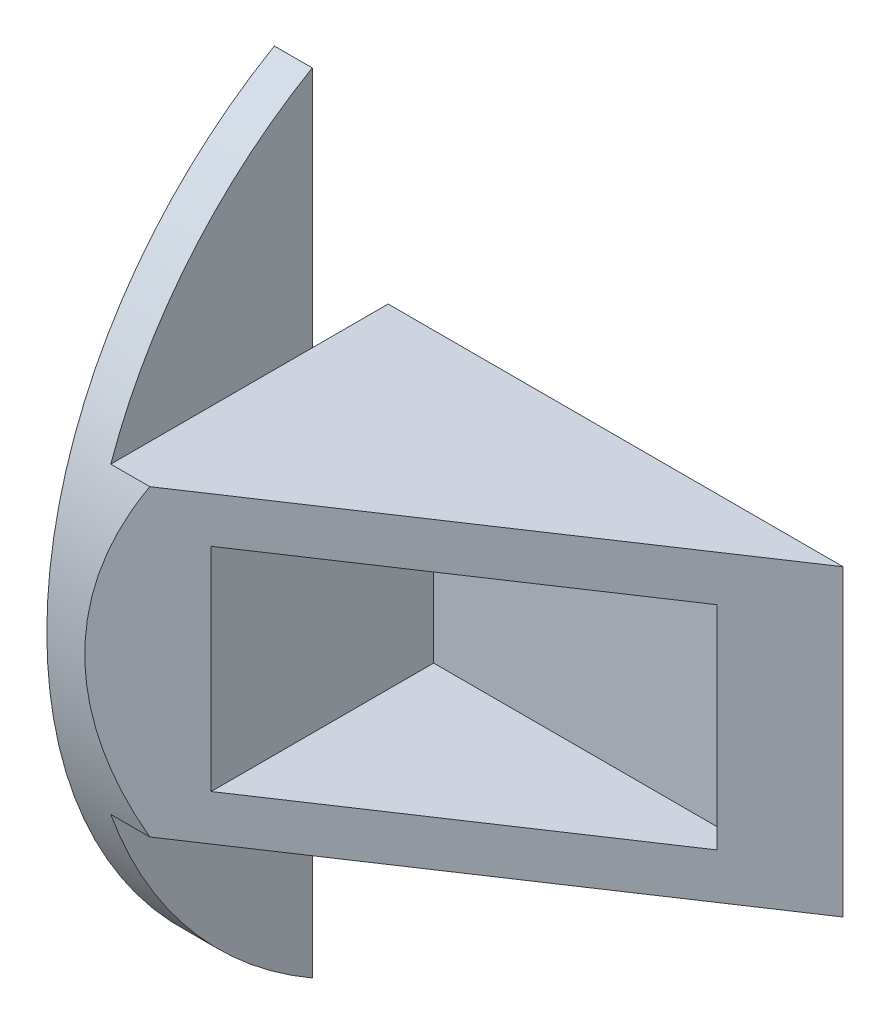
ISO-10303-21;
HEADER;
FILE_DESCRIPTION(('STEP AP214'),'2;1');
FILE_NAME('part.step','',(''),(''),'','','');
FILE_SCHEMA(('AUTOMOTIVE_DESIGN { 1 0 10303 214 1 1 1 1 }'));
ENDSEC;
DATA;
#1=APPLICATION_CONTEXT('core data for automotive mechanical design processes');
#2=APPLICATION_PROTOCOL_DEFINITION('international standard','automotive_design',2000,#1);
#3=PRODUCT_CONTEXT('',#1,'mechanical');
#4=PRODUCT('Part','Part','',(#3));
#5=PRODUCT_RELATED_PRODUCT_CATEGORY('part','',(#4));
#6=PRODUCT_DEFINITION_FORMATION('','',#4);
#7=PRODUCT_DEFINITION_CONTEXT('part definition',#1,'design');
#8=PRODUCT_DEFINITION('design','',#6,#7);
#9=PRODUCT_DEFINITION_SHAPE('','',#8);
#10=(LENGTH_UNIT() NAMED_UNIT(*) SI_UNIT(.MILLI.,.METRE.));
#11=(NAMED_UNIT(*) PLANE_ANGLE_UNIT() SI_UNIT($,.RADIAN.));
#12=(NAMED_UNIT(*) SI_UNIT($,.STERADIAN.) SOLID_ANGLE_UNIT());
#13=UNCERTAINTY_MEASURE_WITH_UNIT(LENGTH_MEASURE(1.E-05),#10,'distance_accuracy_value','');
#14=(GEOMETRIC_REPRESENTATION_CONTEXT(3) GLOBAL_UNCERTAINTY_ASSIGNED_CONTEXT((#13)) GLOBAL_UNIT_ASSIGNED_CONTEXT((#10,
#11,#12)) REPRESENTATION_CONTEXT('',''));
#15=CARTESIAN_POINT('',(0.,0.,0.));
#16=DIRECTION('',(0.,0.,1.));
#17=DIRECTION('',(1.,0.,0.));
#18=AXIS2_PLACEMENT_3D('',#15,#16,#17);
#19=CARTESIAN_POINT('',(0.,10.,0.));
#20=DIRECTION('',(-0.554700196225229,0.,-0.832050294337844));
#21=DIRECTION('',(-0.832050294337844,0.,0.554700196225229));
#22=AXIS2_PLACEMENT_3D('',#19,#20,#21);
#23=PLANE('',#22);
#24=DIRECTION('',(0.,-1.,0.));
#25=VECTOR('',#24,1.);
#26=CARTESIAN_POINT('',(-10.,10.,6.66666666666667));
#27=LINE('',#26,#25);
#28=CARTESIAN_POINT('',(-10.,7.,6.66666666666667));
#29=VERTEX_POINT('',#28);
#30=CARTESIAN_POINT('',(-10.,-7.,6.66666666666667));
#31=VERTEX_POINT('',#30);
#32=EDGE_CURVE('E49',#29,#31,#27,.T.);
#33=ORIENTED_EDGE('',*,*,#32,.F.);
#34=DIRECTION('',(0.832050294337844,0.,-0.554700196225229));
#35=VECTOR('',#34,1.);
#36=CARTESIAN_POINT('',(0.,7.,0.));
#37=LINE('',#36,#35);
#38=CARTESIAN_POINT('',(10.,7.,-6.66666666666667));
#39=VERTEX_POINT('',#38);
#40=EDGE_CURVE('E203',#29,#39,#37,.T.);
#41=ORIENTED_EDGE('',*,*,#40,.T.);
#42=DIRECTION('',(0.,-1.,0.));
#43=VECTOR('',#42,1.);
#44=CARTESIAN_POINT('',(10.,10.,-6.66666666666667));
#45=LINE('',#44,#43);
#46=CARTESIAN_POINT('',(10.,-7.,-6.66666666666667));
#47=VERTEX_POINT('',#46);
#48=EDGE_CURVE('E200',#39,#47,#45,.T.);
#49=ORIENTED_EDGE('',*,*,#48,.T.);
#50=DIRECTION('',(-0.832050294337844,0.,0.554700196225229));
#51=VECTOR('',#50,1.);
#52=CARTESIAN_POINT('',(0.,-7.,0.));
#53=LINE('',#52,#51);
#54=EDGE_CURVE('E205',#47,#31,#53,.T.);
#55=ORIENTED_EDGE('',*,*,#54,.T.);
#56=EDGE_LOOP('',(#33,#41,#49,#55));
#57=FACE_BOUND('',#56,.T.);
#58=DIRECTION('',(0.832050294337844,0.,-0.554700196225229));
#59=VECTOR('',#58,1.);
#60=CARTESIAN_POINT('',(0.,10.,0.));
#61=LINE('',#60,#59);
#62=CARTESIAN_POINT('',(-12.4264068711928,10.,8.28427124746189));
#63=VERTEX_POINT('',#62);
#64=CARTESIAN_POINT('',(15.,10.,-10.));
#65=VERTEX_POINT('',#64);
#66=EDGE_CURVE('E187',#63,#65,#61,.T.);
#67=ORIENTED_EDGE('',*,*,#66,.F.);
#68=CARTESIAN_POINT('',(30.,0.,-20.));
#69=DIRECTION('',(-0.554700196225229,0.,-0.832050294337844));
#70=DIRECTION('',(-0.832050294337844,0.,0.554700196225229));
#71=AXIS2_PLACEMENT_3D('',#68,#69,#70);
#72=ELLIPSE('',#71,54.0832691319598,30.);
#73=CARTESIAN_POINT('',(-12.4264068711929,-10.,8.2842712474619));
#74=VERTEX_POINT('',#73);
#75=EDGE_CURVE('E137',#74,#63,#72,.T.);
#76=ORIENTED_EDGE('',*,*,#75,.F.);
#77=DIRECTION('',(0.832050294337844,0.,-0.554700196225229));
#78=VECTOR('',#77,1.);
#79=CARTESIAN_POINT('',(0.,-10.,0.));
#80=LINE('',#79,#78);
#81=CARTESIAN_POINT('',(15.,-10.,-10.));
#82=VERTEX_POINT('',#81);
#83=EDGE_CURVE('E185',#74,#82,#80,.T.);
#84=ORIENTED_EDGE('',*,*,#83,.T.);
#85=DIRECTION('',(0.,-1.,0.));
#86=VECTOR('',#85,1.);
#87=CARTESIAN_POINT('',(15.,10.,-10.));
#88=LINE('',#87,#86);
#89=EDGE_CURVE('E189',#65,#82,#88,.T.);
#90=ORIENTED_EDGE('',*,*,#89,.F.);
#91=EDGE_LOOP('',(#67,#76,#84,#90));
#92=FACE_BOUND('',#91,.T.);
#93=ADVANCED_FACE('F45',(#57,#92),#23,.F.);
#94=CARTESIAN_POINT('',(0.,10.,0.));
#95=DIRECTION('',(0.,1.,0.));
#96=DIRECTION('',(0.,0.,1.));
#97=AXIS2_PLACEMENT_3D('',#94,#95,#96);
#98=PLANE('',#97);
#99=DIRECTION('',(0.,0.,1.));
#100=VECTOR('',#99,1.);
#101=CARTESIAN_POINT('',(-15.,10.,0.));
#102=LINE('',#101,#100);
#103=CARTESIAN_POINT('',(-15.,10.,-5.));
#104=VERTEX_POINT('',#103);
#105=CARTESIAN_POINT('',(-15.,10.,8.28427124746191));
#106=VERTEX_POINT('',#105);
#107=EDGE_CURVE('E142',#104,#106,#102,.T.);
#108=ORIENTED_EDGE('',*,*,#107,.T.);
#109=DIRECTION('',(-1.,0.,0.));
#110=VECTOR('',#109,1.);
#111=CARTESIAN_POINT('',(17.5,10.,8.2842712474619));
#112=LINE('',#111,#110);
#113=EDGE_CURVE('E128',#106,#63,#112,.F.);
#114=ORIENTED_EDGE('',*,*,#113,.T.);
#115=ORIENTED_EDGE('',*,*,#66,.T.);
#116=DIRECTION('',(-1.,0.,0.));
#117=VECTOR('',#116,1.);
#118=CARTESIAN_POINT('',(0.,10.,-10.));
#119=LINE('',#118,#117);
#120=CARTESIAN_POINT('',(-15.,10.,-10.));
#121=VERTEX_POINT('',#120);
#122=EDGE_CURVE('E149',#65,#121,#119,.T.);
#123=ORIENTED_EDGE('',*,*,#122,.T.);
#124=EDGE_CURVE('E145',#121,#104,#102,.T.);
#125=ORIENTED_EDGE('',*,*,#124,.T.);
#126=EDGE_LOOP('',(#108,#114,#115,#123,#125));
#127=FACE_BOUND('',#126,.T.);
#128=ADVANCED_FACE('F143',(#127),#98,.T.);
#129=CARTESIAN_POINT('',(0.,-10.,0.));
#130=DIRECTION('',(0.,1.,0.));
#131=DIRECTION('',(0.,0.,1.));
#132=AXIS2_PLACEMENT_3D('',#129,#130,#131);
#133=PLANE('',#132);
#134=DIRECTION('',(-1.,0.,0.));
#135=VECTOR('',#134,1.);
#136=CARTESIAN_POINT('',(17.5,-10.,8.2842712474619));
#137=LINE('',#136,#135);
#138=CARTESIAN_POINT('',(-15.,-10.,8.2842712474619));
#139=VERTEX_POINT('',#138);
#140=EDGE_CURVE('E255',#139,#74,#137,.F.);
#141=ORIENTED_EDGE('',*,*,#140,.F.);
#142=DIRECTION('',(0.,0.,1.));
#143=VECTOR('',#142,1.);
#144=CARTESIAN_POINT('',(-15.,-10.,0.));
#145=LINE('',#144,#143);
#146=CARTESIAN_POINT('',(-15.,-10.,-5.));
#147=VERTEX_POINT('',#146);
#148=EDGE_CURVE('E69',#147,#139,#145,.T.);
#149=ORIENTED_EDGE('',*,*,#148,.F.);
#150=CARTESIAN_POINT('',(-15.,-10.,-10.));
#151=VERTEX_POINT('',#150);
#152=EDGE_CURVE('E192',#151,#147,#145,.T.);
#153=ORIENTED_EDGE('',*,*,#152,.F.);
#154=DIRECTION('',(-1.,0.,0.));
#155=VECTOR('',#154,1.);
#156=CARTESIAN_POINT('',(0.,-10.,-10.));
#157=LINE('',#156,#155);
#158=EDGE_CURVE('E183',#82,#151,#157,.T.);
#159=ORIENTED_EDGE('',*,*,#158,.F.);
#160=ORIENTED_EDGE('',*,*,#83,.F.);
#161=EDGE_LOOP('',(#141,#149,#153,#159,#160));
#162=FACE_BOUND('',#161,.T.);
#163=ADVANCED_FACE('F242',(#162),#133,.F.);
#164=CARTESIAN_POINT('',(-15.,10.,0.));
#165=DIRECTION('',(1.,0.,0.));
#166=DIRECTION('',(0.,0.,-1.));
#167=AXIS2_PLACEMENT_3D('',#164,#165,#166);
#168=PLANE('',#167);
#169=DIRECTION('',(0.,-1.,0.));
#170=VECTOR('',#169,1.);
#171=CARTESIAN_POINT('',(-15.,0.,-5.));
#172=LINE('',#171,#170);
#173=EDGE_CURVE('E12',#104,#147,#172,.T.);
#174=ORIENTED_EDGE('',*,*,#173,.F.);
#175=ORIENTED_EDGE('',*,*,#124,.F.);
#176=DIRECTION('',(0.,-1.,0.));
#177=VECTOR('',#176,1.);
#178=CARTESIAN_POINT('',(-15.,10.,-10.));
#179=LINE('',#178,#177);
#180=EDGE_CURVE('E197',#121,#151,#179,.T.);
#181=ORIENTED_EDGE('',*,*,#180,.T.);
#182=ORIENTED_EDGE('',*,*,#152,.T.);
#183=EDGE_LOOP('',(#174,#175,#181,#182));
#184=FACE_BOUND('',#183,.T.);
#185=ADVANCED_FACE('F245',(#184),#168,.F.);
#186=CARTESIAN_POINT('',(0.,10.,-10.));
#187=DIRECTION('',(0.,0.,1.));
#188=DIRECTION('',(1.,0.,0.));
#189=AXIS2_PLACEMENT_3D('',#186,#187,#188);
#190=PLANE('',#189);
#191=ORIENTED_EDGE('',*,*,#158,.T.);
#192=ORIENTED_EDGE('',*,*,#180,.F.);
#193=ORIENTED_EDGE('',*,*,#122,.F.);
#194=ORIENTED_EDGE('',*,*,#89,.T.);
#195=EDGE_LOOP('',(#191,#192,#193,#194));
#196=FACE_BOUND('',#195,.T.);
#197=ADVANCED_FACE('F47',(#196),#190,.F.);
#198=CARTESIAN_POINT('',(-10.,-7.,8.));
#199=DIRECTION('',(0.,-1.,0.));
#200=DIRECTION('',(0.,0.,-1.));
#201=AXIS2_PLACEMENT_3D('',#198,#199,#200);
#202=PLANE('',#201);
#203=DIRECTION('',(0.,0.,-1.));
#204=VECTOR('',#203,1.);
#205=CARTESIAN_POINT('',(10.,-7.,8.));
#206=LINE('',#205,#204);
#207=CARTESIAN_POINT('',(10.,-7.,-8.));
#208=VERTEX_POINT('',#207);
#209=EDGE_CURVE('E168',#47,#208,#206,.T.);
#210=ORIENTED_EDGE('',*,*,#209,.T.);
#211=DIRECTION('',(1.,0.,0.));
#212=VECTOR('',#211,1.);
#213=CARTESIAN_POINT('',(-10.,-7.,-8.));
#214=LINE('',#213,#212);
#215=CARTESIAN_POINT('',(-10.,-7.,-8.));
#216=VERTEX_POINT('',#215);
#217=EDGE_CURVE('E180',#216,#208,#214,.T.);
#218=ORIENTED_EDGE('',*,*,#217,.F.);
#219=DIRECTION('',(0.,0.,-1.));
#220=VECTOR('',#219,1.);
#221=CARTESIAN_POINT('',(-10.,-7.,8.));
#222=LINE('',#221,#220);
#223=EDGE_CURVE('E171',#31,#216,#222,.T.);
#224=ORIENTED_EDGE('',*,*,#223,.F.);
#225=ORIENTED_EDGE('',*,*,#54,.F.);
#226=EDGE_LOOP('',(#210,#218,#224,#225));
#227=FACE_BOUND('',#226,.T.);
#228=ADVANCED_FACE('F216',(#227),#202,.F.);
#229=CARTESIAN_POINT('',(-10.,7.,8.));
#230=DIRECTION('',(0.,1.,0.));
#231=DIRECTION('',(0.,0.,1.));
#232=AXIS2_PLACEMENT_3D('',#229,#230,#231);
#233=PLANE('',#232);
#234=DIRECTION('',(0.,0.,1.));
#235=VECTOR('',#234,1.);
#236=CARTESIAN_POINT('',(-10.,7.,8.));
#237=LINE('',#236,#235);
#238=CARTESIAN_POINT('',(-10.,7.,-8.));
#239=VERTEX_POINT('',#238);
#240=EDGE_CURVE('E167',#239,#29,#237,.T.);
#241=ORIENTED_EDGE('',*,*,#240,.F.);
#242=DIRECTION('',(1.,0.,0.));
#243=VECTOR('',#242,1.);
#244=CARTESIAN_POINT('',(-10.,7.,-8.));
#245=LINE('',#244,#243);
#246=CARTESIAN_POINT('',(10.,7.,-8.));
#247=VERTEX_POINT('',#246);
#248=EDGE_CURVE('E173',#239,#247,#245,.T.);
#249=ORIENTED_EDGE('',*,*,#248,.T.);
#250=DIRECTION('',(0.,0.,1.));
#251=VECTOR('',#250,1.);
#252=CARTESIAN_POINT('',(10.,7.,8.));
#253=LINE('',#252,#251);
#254=EDGE_CURVE('E176',#247,#39,#253,.T.);
#255=ORIENTED_EDGE('',*,*,#254,.T.);
#256=ORIENTED_EDGE('',*,*,#40,.F.);
#257=EDGE_LOOP('',(#241,#249,#255,#256));
#258=FACE_BOUND('',#257,.T.);
#259=ADVANCED_FACE('F223',(#258),#233,.F.);
#260=CARTESIAN_POINT('',(-10.,0.,0.));
#261=DIRECTION('',(1.,0.,0.));
#262=DIRECTION('',(0.,0.,-1.));
#263=AXIS2_PLACEMENT_3D('',#260,#261,#262);
#264=PLANE('',#263);
#265=ORIENTED_EDGE('',*,*,#32,.T.);
#266=ORIENTED_EDGE('',*,*,#223,.T.);
#267=DIRECTION('',(0.,1.,0.));
#268=VECTOR('',#267,1.);
#269=CARTESIAN_POINT('',(-10.,7.,-8.));
#270=LINE('',#269,#268);
#271=EDGE_CURVE('E164',#216,#239,#270,.T.);
#272=ORIENTED_EDGE('',*,*,#271,.T.);
#273=ORIENTED_EDGE('',*,*,#240,.T.);
#274=EDGE_LOOP('',(#265,#266,#272,#273));
#275=FACE_BOUND('',#274,.T.);
#276=ADVANCED_FACE('F212',(#275),#264,.T.);
#277=CARTESIAN_POINT('',(10.,0.,0.));
#278=DIRECTION('',(1.,0.,0.));
#279=DIRECTION('',(0.,0.,-1.));
#280=AXIS2_PLACEMENT_3D('',#277,#278,#279);
#281=PLANE('',#280);
#282=ORIENTED_EDGE('',*,*,#254,.F.);
#283=DIRECTION('',(0.,1.,0.));
#284=VECTOR('',#283,1.);
#285=CARTESIAN_POINT('',(10.,7.,-8.));
#286=LINE('',#285,#284);
#287=EDGE_CURVE('E163',#208,#247,#286,.T.);
#288=ORIENTED_EDGE('',*,*,#287,.F.);
#289=ORIENTED_EDGE('',*,*,#209,.F.);
#290=ORIENTED_EDGE('',*,*,#48,.F.);
#291=EDGE_LOOP('',(#282,#288,#289,#290));
#292=FACE_BOUND('',#291,.T.);
#293=ADVANCED_FACE('F226',(#292),#281,.F.);
#294=CARTESIAN_POINT('',(-10.,7.,-8.));
#295=DIRECTION('',(0.,0.,-1.));
#296=DIRECTION('',(0.,1.,0.));
#297=AXIS2_PLACEMENT_3D('',#294,#295,#296);
#298=PLANE('',#297);
#299=ORIENTED_EDGE('',*,*,#287,.T.);
#300=ORIENTED_EDGE('',*,*,#248,.F.);
#301=ORIENTED_EDGE('',*,*,#271,.F.);
#302=ORIENTED_EDGE('',*,*,#217,.T.);
#303=EDGE_LOOP('',(#299,#300,#301,#302));
#304=FACE_BOUND('',#303,.T.);
#305=ADVANCED_FACE('F220',(#304),#298,.F.);
#306=CARTESIAN_POINT('',(-15.,0.,0.));
#307=DIRECTION('',(-1.,0.,0.));
#308=DIRECTION('',(0.,0.,1.));
#309=AXIS2_PLACEMENT_3D('',#306,#307,#308);
#310=PLANE('',#309);
#311=CARTESIAN_POINT('',(-15.,-25.9807621135332,-5.));
#312=VERTEX_POINT('',#311);
#313=EDGE_CURVE('E56',#147,#312,#172,.T.);
#314=ORIENTED_EDGE('',*,*,#313,.F.);
#315=ORIENTED_EDGE('',*,*,#148,.T.);
#316=CARTESIAN_POINT('',(-15.,0.,-20.));
#317=DIRECTION('',(-1.,0.,0.));
#318=DIRECTION('',(0.,0.,1.));
#319=AXIS2_PLACEMENT_3D('',#316,#317,#318);
#320=CIRCLE('',#319,30.);
#321=EDGE_CURVE('E152',#312,#139,#320,.T.);
#322=ORIENTED_EDGE('',*,*,#321,.F.);
#323=EDGE_LOOP('',(#314,#315,#322));
#324=FACE_BOUND('',#323,.T.);
#325=ADVANCED_FACE('F233',(#324),#310,.F.);
#326=CARTESIAN_POINT('',(-17.5,0.,-5.));
#327=DIRECTION('',(0.,0.,1.));
#328=DIRECTION('',(1.,0.,0.));
#329=AXIS2_PLACEMENT_3D('',#326,#327,#328);
#330=PLANE('',#329);
#331=CARTESIAN_POINT('',(-15.,25.9807621135332,-5.));
#332=VERTEX_POINT('',#331);
#333=EDGE_CURVE('E55',#332,#104,#172,.T.);
#334=ORIENTED_EDGE('',*,*,#333,.T.);
#335=ORIENTED_EDGE('',*,*,#173,.T.);
#336=ORIENTED_EDGE('',*,*,#313,.T.);
#337=DIRECTION('',(1.,0.,0.));
#338=VECTOR('',#337,1.);
#339=CARTESIAN_POINT('',(-17.5,-25.9807621135332,-5.));
#340=LINE('',#339,#338);
#341=CARTESIAN_POINT('',(-17.5,-25.9807621135332,-5.));
#342=VERTEX_POINT('',#341);
#343=EDGE_CURVE('E159',#342,#312,#340,.T.);
#344=ORIENTED_EDGE('',*,*,#343,.F.);
#345=DIRECTION('',(0.,-1.,0.));
#346=VECTOR('',#345,1.);
#347=CARTESIAN_POINT('',(-17.5,0.,-5.));
#348=LINE('',#347,#346);
#349=CARTESIAN_POINT('',(-17.5,25.9807621135332,-5.));
#350=VERTEX_POINT('',#349);
#351=EDGE_CURVE('E154',#350,#342,#348,.T.);
#352=ORIENTED_EDGE('',*,*,#351,.F.);
#353=DIRECTION('',(1.,0.,0.));
#354=VECTOR('',#353,1.);
#355=CARTESIAN_POINT('',(-17.5,25.9807621135332,-5.));
#356=LINE('',#355,#354);
#357=EDGE_CURVE('E157',#350,#332,#356,.T.);
#358=ORIENTED_EDGE('',*,*,#357,.T.);
#359=EDGE_LOOP('',(#334,#335,#336,#344,#352,#358));
#360=FACE_BOUND('',#359,.T.);
#361=ADVANCED_FACE('F265',(#360),#330,.F.);
#362=CARTESIAN_POINT('',(-17.5,0.,-20.));
#363=DIRECTION('',(1.,0.,0.));
#364=DIRECTION('',(0.,0.,-1.));
#365=AXIS2_PLACEMENT_3D('',#362,#363,#364);
#366=CYLINDRICAL_SURFACE('',#365,30.);
#367=ORIENTED_EDGE('',*,*,#321,.T.);
#368=ORIENTED_EDGE('',*,*,#140,.T.);
#369=ORIENTED_EDGE('',*,*,#75,.T.);
#370=ORIENTED_EDGE('',*,*,#113,.F.);
#371=EDGE_CURVE('E134',#106,#332,#320,.T.);
#372=ORIENTED_EDGE('',*,*,#371,.T.);
#373=ORIENTED_EDGE('',*,*,#357,.F.);
#374=CARTESIAN_POINT('',(-17.5,0.,-20.));
#375=DIRECTION('',(-1.,0.,0.));
#376=DIRECTION('',(0.,0.,1.));
#377=AXIS2_PLACEMENT_3D('',#374,#375,#376);
#378=CIRCLE('',#377,30.);
#379=EDGE_CURVE('E160',#342,#350,#378,.T.);
#380=ORIENTED_EDGE('',*,*,#379,.F.);
#381=ORIENTED_EDGE('',*,*,#343,.T.);
#382=EDGE_LOOP('',(#367,#368,#369,#370,#372,#373,#380,#381));
#383=FACE_BOUND('',#382,.T.);
#384=ADVANCED_FACE('F131',(#383),#366,.T.);
#385=CARTESIAN_POINT('',(-17.5,0.,0.));
#386=DIRECTION('',(-1.,0.,0.));
#387=DIRECTION('',(0.,0.,1.));
#388=AXIS2_PLACEMENT_3D('',#385,#386,#387);
#389=PLANE('',#388);
#390=ORIENTED_EDGE('',*,*,#351,.T.);
#391=ORIENTED_EDGE('',*,*,#379,.T.);
#392=EDGE_LOOP('',(#390,#391));
#393=FACE_BOUND('',#392,.T.);
#394=ADVANCED_FACE('F269',(#393),#389,.T.);
#395=ORIENTED_EDGE('',*,*,#107,.F.);
#396=ORIENTED_EDGE('',*,*,#333,.F.);
#397=ORIENTED_EDGE('',*,*,#371,.F.);
#398=EDGE_LOOP('',(#395,#396,#397));
#399=FACE_BOUND('',#398,.T.);
#400=ADVANCED_FACE('F151',(#399),#310,.F.);
#401=CLOSED_SHELL('',(#93,#128,#163,#185,#197,#228,#259,#276,#293,#305,#325,#361,#384,#394,#400));
#402=MANIFOLD_SOLID_BREP('B2',#401);
#403=ADVANCED_BREP_SHAPE_REPRESENTATION('',(#18,#402),#14);
#404=SHAPE_DEFINITION_REPRESENTATION(#9,#403);
ENDSEC;
END-ISO-10303-21;
